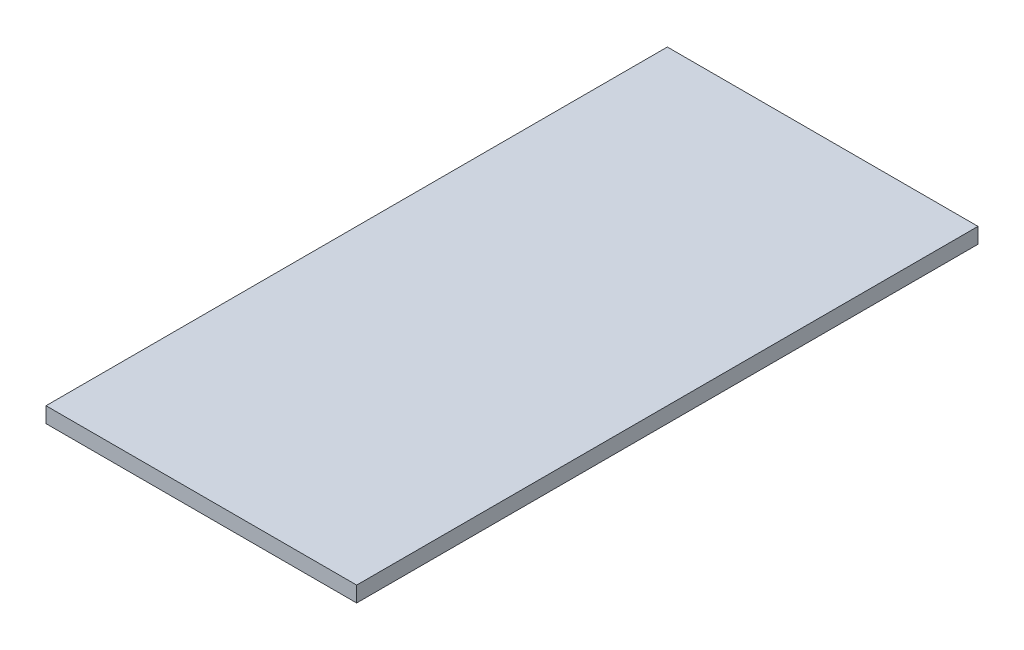
ISO-10303-21;
HEADER;
FILE_DESCRIPTION(('STEP AP214'),'2;1');
FILE_NAME('part.step','',(''),(''),'','','');
FILE_SCHEMA(('AUTOMOTIVE_DESIGN { 1 0 10303 214 1 1 1 1 }'));
ENDSEC;
DATA;
#1=APPLICATION_CONTEXT('core data for automotive mechanical design processes');
#2=APPLICATION_PROTOCOL_DEFINITION('international standard','automotive_design',2000,#1);
#3=PRODUCT_CONTEXT('',#1,'mechanical');
#4=PRODUCT('Part','Part','',(#3));
#5=PRODUCT_RELATED_PRODUCT_CATEGORY('part','',(#4));
#6=PRODUCT_DEFINITION_FORMATION('','',#4);
#7=PRODUCT_DEFINITION_CONTEXT('part definition',#1,'design');
#8=PRODUCT_DEFINITION('design','',#6,#7);
#9=PRODUCT_DEFINITION_SHAPE('','',#8);
#10=(LENGTH_UNIT() NAMED_UNIT(*) SI_UNIT(.MILLI.,.METRE.));
#11=(NAMED_UNIT(*) PLANE_ANGLE_UNIT() SI_UNIT($,.RADIAN.));
#12=(NAMED_UNIT(*) SI_UNIT($,.STERADIAN.) SOLID_ANGLE_UNIT());
#13=UNCERTAINTY_MEASURE_WITH_UNIT(LENGTH_MEASURE(1.E-05),#10,'distance_accuracy_value','');
#14=(GEOMETRIC_REPRESENTATION_CONTEXT(3) GLOBAL_UNCERTAINTY_ASSIGNED_CONTEXT((#13)) GLOBAL_UNIT_ASSIGNED_CONTEXT((#10,
#11,#12)) REPRESENTATION_CONTEXT('',''));
#15=CARTESIAN_POINT('',(0.,0.,0.));
#16=DIRECTION('',(0.,0.,1.));
#17=DIRECTION('',(1.,0.,0.));
#18=AXIS2_PLACEMENT_3D('',#15,#16,#17);
#19=CARTESIAN_POINT('',(50.,5.,-100.));
#20=DIRECTION('',(-1.,0.,0.));
#21=DIRECTION('',(0.,0.,1.));
#22=AXIS2_PLACEMENT_3D('',#19,#20,#21);
#23=PLANE('',#22);
#24=DIRECTION('',(0.,0.,-1.));
#25=VECTOR('',#24,1.);
#26=CARTESIAN_POINT('',(50.,0.,-100.));
#27=LINE('',#26,#25);
#28=CARTESIAN_POINT('',(50.,0.,100.));
#29=VERTEX_POINT('',#28);
#30=CARTESIAN_POINT('',(50.,0.,-100.));
#31=VERTEX_POINT('',#30);
#32=EDGE_CURVE('E96',#29,#31,#27,.T.);
#33=ORIENTED_EDGE('',*,*,#32,.T.);
#34=DIRECTION('',(0.,-1.,0.));
#35=VECTOR('',#34,1.);
#36=CARTESIAN_POINT('',(50.,5.,-100.));
#37=LINE('',#36,#35);
#38=CARTESIAN_POINT('',(50.,5.,-100.));
#39=VERTEX_POINT('',#38);
#40=EDGE_CURVE('E11',#39,#31,#37,.T.);
#41=ORIENTED_EDGE('',*,*,#40,.F.);
#42=DIRECTION('',(0.,0.,-1.));
#43=VECTOR('',#42,1.);
#44=CARTESIAN_POINT('',(50.,5.,-100.));
#45=LINE('',#44,#43);
#46=CARTESIAN_POINT('',(50.,5.,100.));
#47=VERTEX_POINT('',#46);
#48=EDGE_CURVE('E84',#47,#39,#45,.T.);
#49=ORIENTED_EDGE('',*,*,#48,.F.);
#50=DIRECTION('',(0.,-1.,0.));
#51=VECTOR('',#50,1.);
#52=CARTESIAN_POINT('',(50.,5.,100.));
#53=LINE('',#52,#51);
#54=EDGE_CURVE('E92',#47,#29,#53,.T.);
#55=ORIENTED_EDGE('',*,*,#54,.T.);
#56=EDGE_LOOP('',(#33,#41,#49,#55));
#57=FACE_BOUND('',#56,.T.);
#58=ADVANCED_FACE('F33',(#57),#23,.F.);
#59=CARTESIAN_POINT('',(-50.,5.,-100.));
#60=DIRECTION('',(0.,0.,1.));
#61=DIRECTION('',(1.,0.,0.));
#62=AXIS2_PLACEMENT_3D('',#59,#60,#61);
#63=PLANE('',#62);
#64=DIRECTION('',(-1.,0.,0.));
#65=VECTOR('',#64,1.);
#66=CARTESIAN_POINT('',(-50.,0.,-100.));
#67=LINE('',#66,#65);
#68=CARTESIAN_POINT('',(-50.,0.,-100.));
#69=VERTEX_POINT('',#68);
#70=EDGE_CURVE('E88',#31,#69,#67,.T.);
#71=ORIENTED_EDGE('',*,*,#70,.T.);
#72=DIRECTION('',(0.,-1.,0.));
#73=VECTOR('',#72,1.);
#74=CARTESIAN_POINT('',(-50.,5.,-100.));
#75=LINE('',#74,#73);
#76=CARTESIAN_POINT('',(-50.,5.,-100.));
#77=VERTEX_POINT('',#76);
#78=EDGE_CURVE('E41',#77,#69,#75,.T.);
#79=ORIENTED_EDGE('',*,*,#78,.F.);
#80=DIRECTION('',(-1.,0.,0.));
#81=VECTOR('',#80,1.);
#82=CARTESIAN_POINT('',(-50.,5.,-100.));
#83=LINE('',#82,#81);
#84=EDGE_CURVE('E79',#39,#77,#83,.T.);
#85=ORIENTED_EDGE('',*,*,#84,.F.);
#86=ORIENTED_EDGE('',*,*,#40,.T.);
#87=EDGE_LOOP('',(#71,#79,#85,#86));
#88=FACE_BOUND('',#87,.T.);
#89=ADVANCED_FACE('F87',(#88),#63,.F.);
#90=CARTESIAN_POINT('',(-50.,5.,-100.));
#91=DIRECTION('',(1.,0.,0.));
#92=DIRECTION('',(0.,0.,-1.));
#93=AXIS2_PLACEMENT_3D('',#90,#91,#92);
#94=PLANE('',#93);
#95=DIRECTION('',(0.,0.,1.));
#96=VECTOR('',#95,1.);
#97=CARTESIAN_POINT('',(-50.,0.,-100.));
#98=LINE('',#97,#96);
#99=CARTESIAN_POINT('',(-50.,0.,100.));
#100=VERTEX_POINT('',#99);
#101=EDGE_CURVE('E66',#69,#100,#98,.T.);
#102=ORIENTED_EDGE('',*,*,#101,.T.);
#103=DIRECTION('',(0.,-1.,0.));
#104=VECTOR('',#103,1.);
#105=CARTESIAN_POINT('',(-50.,5.,100.));
#106=LINE('',#105,#104);
#107=CARTESIAN_POINT('',(-50.,5.,100.));
#108=VERTEX_POINT('',#107);
#109=EDGE_CURVE('E89',#108,#100,#106,.T.);
#110=ORIENTED_EDGE('',*,*,#109,.F.);
#111=DIRECTION('',(0.,0.,1.));
#112=VECTOR('',#111,1.);
#113=CARTESIAN_POINT('',(-50.,5.,-100.));
#114=LINE('',#113,#112);
#115=EDGE_CURVE('E82',#77,#108,#114,.T.);
#116=ORIENTED_EDGE('',*,*,#115,.F.);
#117=ORIENTED_EDGE('',*,*,#78,.T.);
#118=EDGE_LOOP('',(#102,#110,#116,#117));
#119=FACE_BOUND('',#118,.T.);
#120=ADVANCED_FACE('F90',(#119),#94,.F.);
#121=CARTESIAN_POINT('',(-50.,5.,100.));
#122=DIRECTION('',(0.,0.,-1.));
#123=DIRECTION('',(-1.,0.,0.));
#124=AXIS2_PLACEMENT_3D('',#121,#122,#123);
#125=PLANE('',#124);
#126=DIRECTION('',(1.,0.,0.));
#127=VECTOR('',#126,1.);
#128=CARTESIAN_POINT('',(-50.,0.,100.));
#129=LINE('',#128,#127);
#130=EDGE_CURVE('E72',#100,#29,#129,.T.);
#131=ORIENTED_EDGE('',*,*,#130,.T.);
#132=ORIENTED_EDGE('',*,*,#54,.F.);
#133=DIRECTION('',(1.,0.,0.));
#134=VECTOR('',#133,1.);
#135=CARTESIAN_POINT('',(-50.,5.,100.));
#136=LINE('',#135,#134);
#137=EDGE_CURVE('E49',#108,#47,#136,.T.);
#138=ORIENTED_EDGE('',*,*,#137,.F.);
#139=ORIENTED_EDGE('',*,*,#109,.T.);
#140=EDGE_LOOP('',(#131,#132,#138,#139));
#141=FACE_BOUND('',#140,.T.);
#142=ADVANCED_FACE('F103',(#141),#125,.F.);
#143=CARTESIAN_POINT('',(0.,5.,0.));
#144=DIRECTION('',(0.,1.,0.));
#145=DIRECTION('',(0.,0.,1.));
#146=AXIS2_PLACEMENT_3D('',#143,#144,#145);
#147=PLANE('',#146);
#148=ORIENTED_EDGE('',*,*,#48,.T.);
#149=ORIENTED_EDGE('',*,*,#84,.T.);
#150=ORIENTED_EDGE('',*,*,#115,.T.);
#151=ORIENTED_EDGE('',*,*,#137,.T.);
#152=EDGE_LOOP('',(#148,#149,#150,#151));
#153=FACE_BOUND('',#152,.T.);
#154=ADVANCED_FACE('F80',(#153),#147,.T.);
#155=CARTESIAN_POINT('',(0.,0.,0.));
#156=DIRECTION('',(0.,1.,0.));
#157=DIRECTION('',(0.,0.,1.));
#158=AXIS2_PLACEMENT_3D('',#155,#156,#157);
#159=PLANE('',#158);
#160=ORIENTED_EDGE('',*,*,#32,.F.);
#161=ORIENTED_EDGE('',*,*,#130,.F.);
#162=ORIENTED_EDGE('',*,*,#101,.F.);
#163=ORIENTED_EDGE('',*,*,#70,.F.);
#164=EDGE_LOOP('',(#160,#161,#162,#163));
#165=FACE_BOUND('',#164,.T.);
#166=ADVANCED_FACE('F106',(#165),#159,.F.);
#167=CLOSED_SHELL('',(#58,#89,#120,#142,#154,#166));
#168=MANIFOLD_SOLID_BREP('B2',#167);
#169=ADVANCED_BREP_SHAPE_REPRESENTATION('',(#18,#168),#14);
#170=SHAPE_DEFINITION_REPRESENTATION(#9,#169);
ENDSEC;
END-ISO-10303-21;
